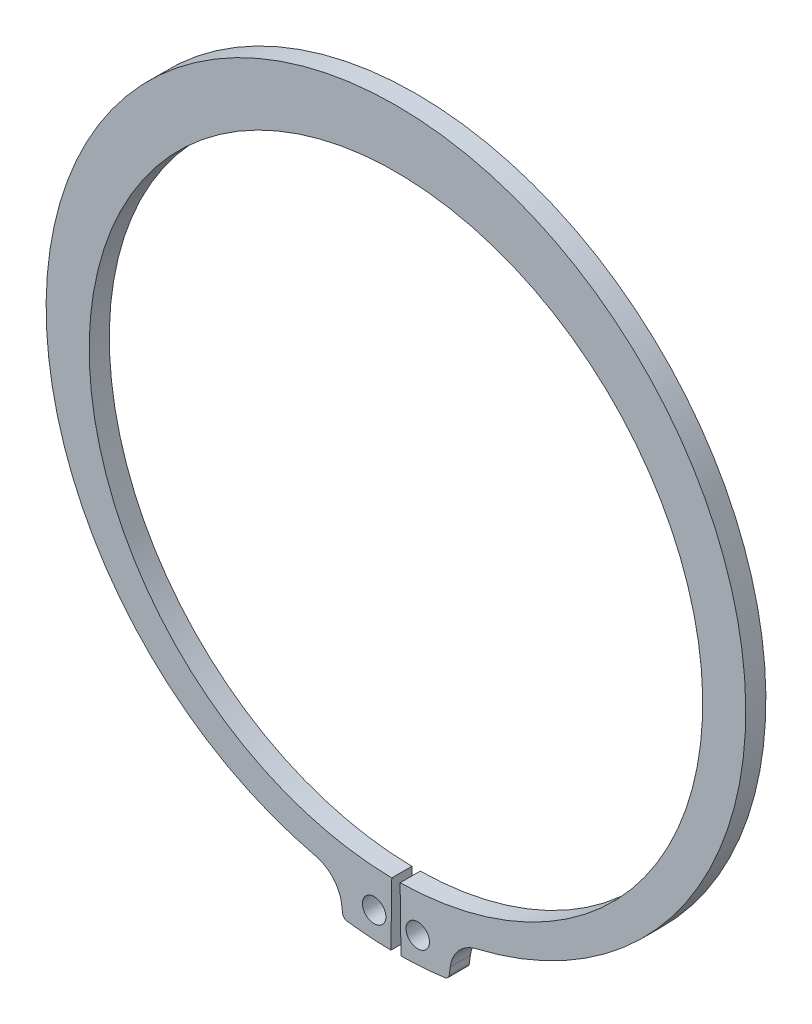
ISO-10303-21;
HEADER;
FILE_DESCRIPTION(('STEP AP214'),'2;1');
FILE_NAME('part.step','',(''),(''),'','','');
FILE_SCHEMA(('AUTOMOTIVE_DESIGN { 1 0 10303 214 1 1 1 1 }'));
ENDSEC;
DATA;
#1=APPLICATION_CONTEXT('core data for automotive mechanical design processes');
#2=APPLICATION_PROTOCOL_DEFINITION('international standard','automotive_design',2000,#1);
#3=PRODUCT_CONTEXT('',#1,'mechanical');
#4=PRODUCT('Part','Part','',(#3));
#5=PRODUCT_RELATED_PRODUCT_CATEGORY('part','',(#4));
#6=PRODUCT_DEFINITION_FORMATION('','',#4);
#7=PRODUCT_DEFINITION_CONTEXT('part definition',#1,'design');
#8=PRODUCT_DEFINITION('design','',#6,#7);
#9=PRODUCT_DEFINITION_SHAPE('','',#8);
#10=(LENGTH_UNIT() NAMED_UNIT(*) SI_UNIT(.MILLI.,.METRE.));
#11=(NAMED_UNIT(*) PLANE_ANGLE_UNIT() SI_UNIT($,.RADIAN.));
#12=(NAMED_UNIT(*) SI_UNIT($,.STERADIAN.) SOLID_ANGLE_UNIT());
#13=UNCERTAINTY_MEASURE_WITH_UNIT(LENGTH_MEASURE(1.E-05),#10,'distance_accuracy_value','');
#14=(GEOMETRIC_REPRESENTATION_CONTEXT(3) GLOBAL_UNCERTAINTY_ASSIGNED_CONTEXT((#13)) GLOBAL_UNIT_ASSIGNED_CONTEXT((#10,
#11,#12)) REPRESENTATION_CONTEXT('',''));
#15=CARTESIAN_POINT('',(0.,0.,0.));
#16=DIRECTION('',(0.,0.,1.));
#17=DIRECTION('',(1.,0.,0.));
#18=AXIS2_PLACEMENT_3D('',#15,#16,#17);
#19=CARTESIAN_POINT('',(0.,0.,-3.));
#20=DIRECTION('',(0.,0.,1.));
#21=DIRECTION('',(1.,0.,0.));
#22=AXIS2_PLACEMENT_3D('',#19,#20,#21);
#23=CYLINDRICAL_SURFACE('',#22,45.75);
#24=CARTESIAN_POINT('',(0.,0.,0.));
#25=DIRECTION('',(0.,0.,-1.));
#26=DIRECTION('',(1.,0.,0.));
#27=AXIS2_PLACEMENT_3D('',#24,#25,#26);
#28=CIRCLE('',#27,45.75);
#29=CARTESIAN_POINT('',(-0.622166817769719,-45.7457692956504,0.));
#30=VERTEX_POINT('',#29);
#31=CARTESIAN_POINT('',(0.622166817769719,-45.7457692956504,0.));
#32=VERTEX_POINT('',#31);
#33=EDGE_CURVE('E154',#30,#32,#28,.T.);
#34=ORIENTED_EDGE('',*,*,#33,.F.);
#35=DIRECTION('',(0.,0.,1.));
#36=VECTOR('',#35,1.);
#37=CARTESIAN_POINT('',(-0.622166817769719,-45.7457692956504,-3.));
#38=LINE('',#37,#36);
#39=CARTESIAN_POINT('',(-0.622166817769719,-45.7457692956504,-3.));
#40=VERTEX_POINT('',#39);
#41=EDGE_CURVE('E11',#40,#30,#38,.T.);
#42=ORIENTED_EDGE('',*,*,#41,.F.);
#43=CARTESIAN_POINT('',(0.,0.,-3.));
#44=DIRECTION('',(0.,0.,-1.));
#45=DIRECTION('',(1.,0.,0.));
#46=AXIS2_PLACEMENT_3D('',#43,#44,#45);
#47=CIRCLE('',#46,45.75);
#48=CARTESIAN_POINT('',(0.622166817769719,-45.7457692956504,-3.));
#49=VERTEX_POINT('',#48);
#50=EDGE_CURVE('E187',#40,#49,#47,.T.);
#51=ORIENTED_EDGE('',*,*,#50,.T.);
#52=DIRECTION('',(0.,0.,1.));
#53=VECTOR('',#52,1.);
#54=CARTESIAN_POINT('',(0.622166817769719,-45.7457692956504,-3.));
#55=LINE('',#54,#53);
#56=EDGE_CURVE('E36',#49,#32,#55,.T.);
#57=ORIENTED_EDGE('',*,*,#56,.T.);
#58=EDGE_LOOP('',(#34,#42,#51,#57));
#59=FACE_BOUND('',#58,.T.);
#60=ADVANCED_FACE('F33',(#59),#23,.F.);
#61=CARTESIAN_POINT('',(-0.622166817769719,-45.7457692956504,-3.));
#62=DIRECTION('',(0.999907525587986,-0.0135992747053491,0.));
#63=DIRECTION('',(0.0135992747053491,0.999907525587986,0.));
#64=AXIS2_PLACEMENT_3D('',#61,#62,#63);
#65=PLANE('',#64);
#66=DIRECTION('',(0.0135992747053491,0.999907525587986,0.));
#67=VECTOR('',#66,1.);
#68=CARTESIAN_POINT('',(-0.622166817769719,-45.7457692956504,0.));
#69=LINE('',#68,#67);
#70=CARTESIAN_POINT('',(-0.75,-55.1449000361774,0.));
#71=VERTEX_POINT('',#70);
#72=EDGE_CURVE('E185',#71,#30,#69,.T.);
#73=ORIENTED_EDGE('',*,*,#72,.F.);
#74=DIRECTION('',(0.,0.,1.));
#75=VECTOR('',#74,1.);
#76=CARTESIAN_POINT('',(-0.75,-55.1449000361774,-3.));
#77=LINE('',#76,#75);
#78=CARTESIAN_POINT('',(-0.75,-55.1449000361774,-3.));
#79=VERTEX_POINT('',#78);
#80=EDGE_CURVE('E42',#79,#71,#77,.T.);
#81=ORIENTED_EDGE('',*,*,#80,.F.);
#82=DIRECTION('',(0.0135992747053491,0.999907525587986,0.));
#83=VECTOR('',#82,1.);
#84=CARTESIAN_POINT('',(-0.622166817769719,-45.7457692956504,-3.));
#85=LINE('',#84,#83);
#86=EDGE_CURVE('E144',#79,#40,#85,.T.);
#87=ORIENTED_EDGE('',*,*,#86,.T.);
#88=ORIENTED_EDGE('',*,*,#41,.T.);
#89=EDGE_LOOP('',(#73,#81,#87,#88));
#90=FACE_BOUND('',#89,.T.);
#91=ADVANCED_FACE('F207',(#90),#65,.T.);
#92=CARTESIAN_POINT('',(0.,0.,-3.));
#93=DIRECTION('',(0.,0.,1.));
#94=DIRECTION('',(1.,0.,0.));
#95=AXIS2_PLACEMENT_3D('',#92,#93,#94);
#96=CYLINDRICAL_SURFACE('',#95,55.15);
#97=CARTESIAN_POINT('',(0.,0.,0.));
#98=DIRECTION('',(0.,0.,1.));
#99=DIRECTION('',(1.,0.,0.));
#100=AXIS2_PLACEMENT_3D('',#97,#98,#99);
#101=CIRCLE('',#100,55.15);
#102=CARTESIAN_POINT('',(-7.3051029380383,-54.6640464205191,0.));
#103=VERTEX_POINT('',#102);
#104=EDGE_CURVE('E131',#103,#71,#101,.T.);
#105=ORIENTED_EDGE('',*,*,#104,.F.);
#106=DIRECTION('',(0.,0.,1.));
#107=VECTOR('',#106,1.);
#108=CARTESIAN_POINT('',(-7.3051029380383,-54.6640464205191,-3.));
#109=LINE('',#108,#107);
#110=CARTESIAN_POINT('',(-7.3051029380383,-54.6640464205191,-3.));
#111=VERTEX_POINT('',#110);
#112=EDGE_CURVE('E126',#111,#103,#109,.T.);
#113=ORIENTED_EDGE('',*,*,#112,.F.);
#114=CARTESIAN_POINT('',(0.,0.,-3.));
#115=DIRECTION('',(0.,0.,1.));
#116=DIRECTION('',(1.,0.,0.));
#117=AXIS2_PLACEMENT_3D('',#114,#115,#116);
#118=CIRCLE('',#117,55.15);
#119=EDGE_CURVE('E129',#111,#79,#118,.T.);
#120=ORIENTED_EDGE('',*,*,#119,.T.);
#121=ORIENTED_EDGE('',*,*,#80,.T.);
#122=EDGE_LOOP('',(#105,#113,#120,#121));
#123=FACE_BOUND('',#122,.T.);
#124=ADVANCED_FACE('F128',(#123),#96,.T.);
#125=CARTESIAN_POINT('',(-7.20575883643307,-53.9206550367405,-3.));
#126=DIRECTION('',(0.,0.,1.));
#127=DIRECTION('',(1.,0.,0.));
#128=AXIS2_PLACEMENT_3D('',#125,#126,#127);
#129=CYLINDRICAL_SURFACE('',#128,0.749999999999999);
#130=CARTESIAN_POINT('',(-7.20575883643307,-53.9206550367405,0.));
#131=DIRECTION('',(0.,0.,1.));
#132=DIRECTION('',(1.,0.,0.));
#133=AXIS2_PLACEMENT_3D('',#130,#131,#132);
#134=CIRCLE('',#133,0.749999999999999);
#135=CARTESIAN_POINT('',(-7.94934248246343,-54.0185496809055,0.));
#136=VERTEX_POINT('',#135);
#137=EDGE_CURVE('E182',#136,#103,#134,.T.);
#138=ORIENTED_EDGE('',*,*,#137,.F.);
#139=DIRECTION('',(0.,0.,1.));
#140=VECTOR('',#139,1.);
#141=CARTESIAN_POINT('',(-7.94934248246343,-54.0185496809055,-3.));
#142=LINE('',#141,#140);
#143=CARTESIAN_POINT('',(-7.94934248246343,-54.0185496809055,-3.));
#144=VERTEX_POINT('',#143);
#145=EDGE_CURVE('E136',#144,#136,#142,.T.);
#146=ORIENTED_EDGE('',*,*,#145,.F.);
#147=CARTESIAN_POINT('',(-7.20575883643307,-53.9206550367405,-3.));
#148=DIRECTION('',(0.,0.,1.));
#149=DIRECTION('',(1.,0.,0.));
#150=AXIS2_PLACEMENT_3D('',#147,#148,#149);
#151=CIRCLE('',#150,0.749999999999999);
#152=EDGE_CURVE('E142',#144,#111,#151,.T.);
#153=ORIENTED_EDGE('',*,*,#152,.T.);
#154=ORIENTED_EDGE('',*,*,#112,.T.);
#155=EDGE_LOOP('',(#138,#146,#153,#154));
#156=FACE_BOUND('',#155,.T.);
#157=ADVANCED_FACE('F146',(#156),#129,.T.);
#158=CARTESIAN_POINT('',(-8.09755659471687,-52.8927517281926,-3.));
#159=DIRECTION('',(-0.99144486137381,-0.130526192220051,0.));
#160=DIRECTION('',(0.130526192220051,-0.991444861373811,0.));
#161=AXIS2_PLACEMENT_3D('',#158,#159,#160);
#162=PLANE('',#161);
#163=DIRECTION('',(0.130526192220051,-0.991444861373811,0.));
#164=VECTOR('',#163,1.);
#165=CARTESIAN_POINT('',(-8.09755659471687,-52.8927517281926,0.));
#166=LINE('',#165,#164);
#167=CARTESIAN_POINT('',(-8.09755659471687,-52.8927517281926,0.));
#168=VERTEX_POINT('',#167);
#169=EDGE_CURVE('E179',#168,#136,#166,.T.);
#170=ORIENTED_EDGE('',*,*,#169,.F.);
#171=DIRECTION('',(0.,0.,1.));
#172=VECTOR('',#171,1.);
#173=CARTESIAN_POINT('',(-8.09755659471687,-52.8927517281926,-3.));
#174=LINE('',#173,#172);
#175=CARTESIAN_POINT('',(-8.09755659471687,-52.8927517281926,-3.));
#176=VERTEX_POINT('',#175);
#177=EDGE_CURVE('E191',#176,#168,#174,.T.);
#178=ORIENTED_EDGE('',*,*,#177,.F.);
#179=DIRECTION('',(0.130526192220051,-0.991444861373811,0.));
#180=VECTOR('',#179,1.);
#181=CARTESIAN_POINT('',(-8.09755659471687,-52.8927517281926,-3.));
#182=LINE('',#181,#180);
#183=EDGE_CURVE('E147',#176,#144,#182,.T.);
#184=ORIENTED_EDGE('',*,*,#183,.T.);
#185=ORIENTED_EDGE('',*,*,#145,.T.);
#186=EDGE_LOOP('',(#170,#178,#184,#185));
#187=FACE_BOUND('',#186,.T.);
#188=ADVANCED_FACE('F220',(#187),#162,.T.);
#189=CARTESIAN_POINT('',(-13.1536965868575,-53.5584051863094,-3.));
#190=DIRECTION('',(0.,0.,1.));
#191=DIRECTION('',(1.,0.,0.));
#192=AXIS2_PLACEMENT_3D('',#189,#190,#191);
#193=CYLINDRICAL_SURFACE('',#192,5.09976922482053);
#194=CARTESIAN_POINT('',(-13.1536965868575,-53.5584051863094,0.));
#195=DIRECTION('',(0.,0.,-1.));
#196=DIRECTION('',(1.,0.,0.));
#197=AXIS2_PLACEMENT_3D('',#194,#195,#196);
#198=CIRCLE('',#197,5.09976922482053);
#199=CARTESIAN_POINT('',(-11.9823803882366,-48.594972451873,0.));
#200=VERTEX_POINT('',#199);
#201=EDGE_CURVE('E176',#200,#168,#198,.T.);
#202=ORIENTED_EDGE('',*,*,#201,.F.);
#203=DIRECTION('',(0.,0.,1.));
#204=VECTOR('',#203,1.);
#205=CARTESIAN_POINT('',(-11.9823803882366,-48.594972451873,-3.));
#206=LINE('',#205,#204);
#207=CARTESIAN_POINT('',(-11.9823803882366,-48.594972451873,-3.));
#208=VERTEX_POINT('',#207);
#209=EDGE_CURVE('E193',#208,#200,#206,.T.);
#210=ORIENTED_EDGE('',*,*,#209,.F.);
#211=CARTESIAN_POINT('',(-13.1536965868575,-53.5584051863094,-3.));
#212=DIRECTION('',(0.,0.,-1.));
#213=DIRECTION('',(1.,0.,0.));
#214=AXIS2_PLACEMENT_3D('',#211,#212,#213);
#215=CIRCLE('',#214,5.09976922482053);
#216=EDGE_CURVE('E149',#208,#176,#215,.T.);
#217=ORIENTED_EDGE('',*,*,#216,.T.);
#218=ORIENTED_EDGE('',*,*,#177,.T.);
#219=EDGE_LOOP('',(#202,#210,#217,#218));
#220=FACE_BOUND('',#219,.T.);
#221=ADVANCED_FACE('F223',(#220),#193,.F.);
#222=CARTESIAN_POINT('',(0.,2.18016335301443,-3.));
#223=DIRECTION('',(0.,0.,1.));
#224=DIRECTION('',(1.,0.,0.));
#225=AXIS2_PLACEMENT_3D('',#222,#223,#224);
#226=CYLINDRICAL_SURFACE('',#225,52.1698366469856);
#227=CARTESIAN_POINT('',(0.,2.18016335301443,0.));
#228=DIRECTION('',(0.,0.,1.));
#229=DIRECTION('',(1.,0.,0.));
#230=AXIS2_PLACEMENT_3D('',#227,#228,#229);
#231=CIRCLE('',#230,52.1698366469856);
#232=CARTESIAN_POINT('',(11.9823803882365,-48.594972451873,0.));
#233=VERTEX_POINT('',#232);
#234=EDGE_CURVE('E173',#233,#200,#231,.T.);
#235=ORIENTED_EDGE('',*,*,#234,.F.);
#236=DIRECTION('',(0.,0.,1.));
#237=VECTOR('',#236,1.);
#238=CARTESIAN_POINT('',(11.9823803882365,-48.594972451873,-3.));
#239=LINE('',#238,#237);
#240=CARTESIAN_POINT('',(11.9823803882365,-48.594972451873,-3.));
#241=VERTEX_POINT('',#240);
#242=EDGE_CURVE('E195',#241,#233,#239,.T.);
#243=ORIENTED_EDGE('',*,*,#242,.F.);
#244=CARTESIAN_POINT('',(0.,2.18016335301443,-3.));
#245=DIRECTION('',(0.,0.,1.));
#246=DIRECTION('',(1.,0.,0.));
#247=AXIS2_PLACEMENT_3D('',#244,#245,#246);
#248=CIRCLE('',#247,52.1698366469856);
#249=EDGE_CURVE('E297',#241,#208,#248,.T.);
#250=ORIENTED_EDGE('',*,*,#249,.T.);
#251=ORIENTED_EDGE('',*,*,#209,.T.);
#252=EDGE_LOOP('',(#235,#243,#250,#251));
#253=FACE_BOUND('',#252,.T.);
#254=ADVANCED_FACE('F227',(#253),#226,.T.);
#255=CARTESIAN_POINT('',(13.1536965868575,-53.5584051863094,-3.));
#256=DIRECTION('',(0.,0.,1.));
#257=DIRECTION('',(1.,0.,0.));
#258=AXIS2_PLACEMENT_3D('',#255,#256,#257);
#259=CYLINDRICAL_SURFACE('',#258,5.09976922482053);
#260=CARTESIAN_POINT('',(13.1536965868575,-53.5584051863094,0.));
#261=DIRECTION('',(0.,0.,-1.));
#262=DIRECTION('',(1.,0.,0.));
#263=AXIS2_PLACEMENT_3D('',#260,#261,#262);
#264=CIRCLE('',#263,5.09976922482053);
#265=CARTESIAN_POINT('',(8.09755659471687,-52.8927517281926,0.));
#266=VERTEX_POINT('',#265);
#267=EDGE_CURVE('E170',#266,#233,#264,.T.);
#268=ORIENTED_EDGE('',*,*,#267,.F.);
#269=DIRECTION('',(0.,0.,1.));
#270=VECTOR('',#269,1.);
#271=CARTESIAN_POINT('',(8.09755659471687,-52.8927517281926,-3.));
#272=LINE('',#271,#270);
#273=CARTESIAN_POINT('',(8.09755659471687,-52.8927517281926,-3.));
#274=VERTEX_POINT('',#273);
#275=EDGE_CURVE('E197',#274,#266,#272,.T.);
#276=ORIENTED_EDGE('',*,*,#275,.F.);
#277=CARTESIAN_POINT('',(13.1536965868575,-53.5584051863094,-3.));
#278=DIRECTION('',(0.,0.,-1.));
#279=DIRECTION('',(1.,0.,0.));
#280=AXIS2_PLACEMENT_3D('',#277,#278,#279);
#281=CIRCLE('',#280,5.09976922482053);
#282=EDGE_CURVE('E294',#274,#241,#281,.T.);
#283=ORIENTED_EDGE('',*,*,#282,.T.);
#284=ORIENTED_EDGE('',*,*,#242,.T.);
#285=EDGE_LOOP('',(#268,#276,#283,#284));
#286=FACE_BOUND('',#285,.T.);
#287=ADVANCED_FACE('F231',(#286),#259,.F.);
#288=CARTESIAN_POINT('',(8.09755659471687,-52.8927517281926,-3.));
#289=DIRECTION('',(0.99144486137381,-0.130526192220051,0.));
#290=DIRECTION('',(0.130526192220051,0.991444861373811,0.));
#291=AXIS2_PLACEMENT_3D('',#288,#289,#290);
#292=PLANE('',#291);
#293=DIRECTION('',(0.130526192220051,0.991444861373811,0.));
#294=VECTOR('',#293,1.);
#295=CARTESIAN_POINT('',(8.09755659471687,-52.8927517281926,0.));
#296=LINE('',#295,#294);
#297=CARTESIAN_POINT('',(7.94934248246343,-54.0185496809055,0.));
#298=VERTEX_POINT('',#297);
#299=EDGE_CURVE('E167',#298,#266,#296,.T.);
#300=ORIENTED_EDGE('',*,*,#299,.F.);
#301=DIRECTION('',(0.,0.,1.));
#302=VECTOR('',#301,1.);
#303=CARTESIAN_POINT('',(7.94934248246343,-54.0185496809055,-3.));
#304=LINE('',#303,#302);
#305=CARTESIAN_POINT('',(7.94934248246343,-54.0185496809055,-3.));
#306=VERTEX_POINT('',#305);
#307=EDGE_CURVE('E199',#306,#298,#304,.T.);
#308=ORIENTED_EDGE('',*,*,#307,.F.);
#309=DIRECTION('',(0.130526192220051,0.991444861373811,0.));
#310=VECTOR('',#309,1.);
#311=CARTESIAN_POINT('',(8.09755659471687,-52.8927517281926,-3.));
#312=LINE('',#311,#310);
#313=EDGE_CURVE('E291',#306,#274,#312,.T.);
#314=ORIENTED_EDGE('',*,*,#313,.T.);
#315=ORIENTED_EDGE('',*,*,#275,.T.);
#316=EDGE_LOOP('',(#300,#308,#314,#315));
#317=FACE_BOUND('',#316,.T.);
#318=ADVANCED_FACE('F235',(#317),#292,.T.);
#319=CARTESIAN_POINT('',(7.20575883643307,-53.9206550367405,-3.));
#320=DIRECTION('',(0.,0.,1.));
#321=DIRECTION('',(1.,0.,0.));
#322=AXIS2_PLACEMENT_3D('',#319,#320,#321);
#323=CYLINDRICAL_SURFACE('',#322,0.749999999999999);
#324=CARTESIAN_POINT('',(7.20575883643307,-53.9206550367405,0.));
#325=DIRECTION('',(0.,0.,1.));
#326=DIRECTION('',(-1.,0.,0.));
#327=AXIS2_PLACEMENT_3D('',#324,#325,#326);
#328=CIRCLE('',#327,0.749999999999999);
#329=CARTESIAN_POINT('',(7.30510293803831,-54.6640464205191,0.));
#330=VERTEX_POINT('',#329);
#331=EDGE_CURVE('E164',#330,#298,#328,.T.);
#332=ORIENTED_EDGE('',*,*,#331,.F.);
#333=DIRECTION('',(0.,0.,1.));
#334=VECTOR('',#333,1.);
#335=CARTESIAN_POINT('',(7.30510293803831,-54.6640464205191,-3.));
#336=LINE('',#335,#334);
#337=CARTESIAN_POINT('',(7.30510293803831,-54.6640464205191,-3.));
#338=VERTEX_POINT('',#337);
#339=EDGE_CURVE('E201',#338,#330,#336,.T.);
#340=ORIENTED_EDGE('',*,*,#339,.F.);
#341=CARTESIAN_POINT('',(7.20575883643307,-53.9206550367405,-3.));
#342=DIRECTION('',(0.,0.,1.));
#343=DIRECTION('',(-1.,0.,0.));
#344=AXIS2_PLACEMENT_3D('',#341,#342,#343);
#345=CIRCLE('',#344,0.749999999999999);
#346=EDGE_CURVE('E288',#338,#306,#345,.T.);
#347=ORIENTED_EDGE('',*,*,#346,.T.);
#348=ORIENTED_EDGE('',*,*,#307,.T.);
#349=EDGE_LOOP('',(#332,#340,#347,#348));
#350=FACE_BOUND('',#349,.T.);
#351=ADVANCED_FACE('F239',(#350),#323,.T.);
#352=CARTESIAN_POINT('',(0.,0.,-3.));
#353=DIRECTION('',(0.,0.,1.));
#354=DIRECTION('',(1.,0.,0.));
#355=AXIS2_PLACEMENT_3D('',#352,#353,#354);
#356=CYLINDRICAL_SURFACE('',#355,55.15);
#357=CARTESIAN_POINT('',(0.,0.,0.));
#358=DIRECTION('',(0.,0.,1.));
#359=DIRECTION('',(1.,0.,0.));
#360=AXIS2_PLACEMENT_3D('',#357,#358,#359);
#361=CIRCLE('',#360,55.15);
#362=CARTESIAN_POINT('',(0.749999999999962,-55.1449000361774,0.));
#363=VERTEX_POINT('',#362);
#364=EDGE_CURVE('E161',#363,#330,#361,.T.);
#365=ORIENTED_EDGE('',*,*,#364,.F.);
#366=DIRECTION('',(0.,0.,1.));
#367=VECTOR('',#366,1.);
#368=CARTESIAN_POINT('',(0.749999999999962,-55.1449000361774,-3.));
#369=LINE('',#368,#367);
#370=CARTESIAN_POINT('',(0.749999999999962,-55.1449000361774,-3.));
#371=VERTEX_POINT('',#370);
#372=EDGE_CURVE('E202',#371,#363,#369,.T.);
#373=ORIENTED_EDGE('',*,*,#372,.F.);
#374=CARTESIAN_POINT('',(0.,0.,-3.));
#375=DIRECTION('',(0.,0.,1.));
#376=DIRECTION('',(1.,0.,0.));
#377=AXIS2_PLACEMENT_3D('',#374,#375,#376);
#378=CIRCLE('',#377,55.15);
#379=EDGE_CURVE('E285',#371,#338,#378,.T.);
#380=ORIENTED_EDGE('',*,*,#379,.T.);
#381=ORIENTED_EDGE('',*,*,#339,.T.);
#382=EDGE_LOOP('',(#365,#373,#380,#381));
#383=FACE_BOUND('',#382,.T.);
#384=ADVANCED_FACE('F243',(#383),#356,.T.);
#385=CARTESIAN_POINT('',(0.622166817769719,-45.7457692956504,-3.));
#386=DIRECTION('',(-0.999907525587986,-0.0135992747053491,0.));
#387=DIRECTION('',(0.0135992747053491,-0.999907525587986,0.));
#388=AXIS2_PLACEMENT_3D('',#385,#386,#387);
#389=PLANE('',#388);
#390=DIRECTION('',(0.0135992747053491,-0.999907525587986,0.));
#391=VECTOR('',#390,1.);
#392=CARTESIAN_POINT('',(0.622166817769719,-45.7457692956504,0.));
#393=LINE('',#392,#391);
#394=EDGE_CURVE('E157',#32,#363,#393,.T.);
#395=ORIENTED_EDGE('',*,*,#394,.F.);
#396=ORIENTED_EDGE('',*,*,#56,.F.);
#397=DIRECTION('',(0.0135992747053491,-0.999907525587986,0.));
#398=VECTOR('',#397,1.);
#399=CARTESIAN_POINT('',(0.622166817769719,-45.7457692956504,-3.));
#400=LINE('',#399,#398);
#401=EDGE_CURVE('E283',#49,#371,#400,.T.);
#402=ORIENTED_EDGE('',*,*,#401,.T.);
#403=ORIENTED_EDGE('',*,*,#372,.T.);
#404=EDGE_LOOP('',(#395,#396,#402,#403));
#405=FACE_BOUND('',#404,.T.);
#406=ADVANCED_FACE('F204',(#405),#389,.T.);
#407=CARTESIAN_POINT('',(0.,0.,-3.));
#408=DIRECTION('',(0.,0.,1.));
#409=DIRECTION('',(1.,0.,0.));
#410=AXIS2_PLACEMENT_3D('',#407,#408,#409);
#411=PLANE('',#410);
#412=CARTESIAN_POINT('',(-3.25,-51.2219984479325,-3.));
#413=DIRECTION('',(0.,0.,1.));
#414=DIRECTION('',(1.,0.,0.));
#415=AXIS2_PLACEMENT_3D('',#412,#413,#414);
#416=CIRCLE('',#415,1.75);
#417=CARTESIAN_POINT('',(-1.5,-51.2219984479325,-3.));
#418=VERTEX_POINT('',#417);
#419=EDGE_CURVE('E270',#418,#418,#416,.T.);
#420=ORIENTED_EDGE('',*,*,#419,.T.);
#421=EDGE_LOOP('',(#420));
#422=FACE_BOUND('',#421,.T.);
#423=CARTESIAN_POINT('',(3.25,-51.2219984479325,-3.));
#424=DIRECTION('',(0.,0.,1.));
#425=DIRECTION('',(1.,0.,0.));
#426=AXIS2_PLACEMENT_3D('',#423,#424,#425);
#427=CIRCLE('',#426,1.75);
#428=CARTESIAN_POINT('',(5.,-51.2219984479325,-3.));
#429=VERTEX_POINT('',#428);
#430=EDGE_CURVE('E158',#429,#429,#427,.T.);
#431=ORIENTED_EDGE('',*,*,#430,.T.);
#432=EDGE_LOOP('',(#431));
#433=FACE_BOUND('',#432,.T.);
#434=ORIENTED_EDGE('',*,*,#50,.F.);
#435=ORIENTED_EDGE('',*,*,#86,.F.);
#436=ORIENTED_EDGE('',*,*,#119,.F.);
#437=ORIENTED_EDGE('',*,*,#152,.F.);
#438=ORIENTED_EDGE('',*,*,#183,.F.);
#439=ORIENTED_EDGE('',*,*,#216,.F.);
#440=ORIENTED_EDGE('',*,*,#249,.F.);
#441=ORIENTED_EDGE('',*,*,#282,.F.);
#442=ORIENTED_EDGE('',*,*,#313,.F.);
#443=ORIENTED_EDGE('',*,*,#346,.F.);
#444=ORIENTED_EDGE('',*,*,#379,.F.);
#445=ORIENTED_EDGE('',*,*,#401,.F.);
#446=EDGE_LOOP('',(#434,#435,#436,#437,#438,#439,#440,#441,#442,#443,#444,#445));
#447=FACE_BOUND('',#446,.T.);
#448=ADVANCED_FACE('F140',(#422,#433,#447),#411,.F.);
#449=CARTESIAN_POINT('',(0.,0.,0.));
#450=DIRECTION('',(0.,0.,1.));
#451=DIRECTION('',(1.,0.,0.));
#452=AXIS2_PLACEMENT_3D('',#449,#450,#451);
#453=PLANE('',#452);
#454=CARTESIAN_POINT('',(-3.25,-51.2219984479325,0.));
#455=DIRECTION('',(0.,0.,1.));
#456=DIRECTION('',(1.,0.,0.));
#457=AXIS2_PLACEMENT_3D('',#454,#455,#456);
#458=CIRCLE('',#457,1.75);
#459=CARTESIAN_POINT('',(-1.5,-51.2219984479325,0.));
#460=VERTEX_POINT('',#459);
#461=EDGE_CURVE('E273',#460,#460,#458,.T.);
#462=ORIENTED_EDGE('',*,*,#461,.F.);
#463=EDGE_LOOP('',(#462));
#464=FACE_BOUND('',#463,.T.);
#465=CARTESIAN_POINT('',(3.25,-51.2219984479325,0.));
#466=DIRECTION('',(0.,0.,1.));
#467=DIRECTION('',(1.,0.,0.));
#468=AXIS2_PLACEMENT_3D('',#465,#466,#467);
#469=CIRCLE('',#468,1.75);
#470=CARTESIAN_POINT('',(5.,-51.2219984479325,0.));
#471=VERTEX_POINT('',#470);
#472=EDGE_CURVE('E275',#471,#471,#469,.T.);
#473=ORIENTED_EDGE('',*,*,#472,.F.);
#474=EDGE_LOOP('',(#473));
#475=FACE_BOUND('',#474,.T.);
#476=ORIENTED_EDGE('',*,*,#33,.T.);
#477=ORIENTED_EDGE('',*,*,#394,.T.);
#478=ORIENTED_EDGE('',*,*,#364,.T.);
#479=ORIENTED_EDGE('',*,*,#331,.T.);
#480=ORIENTED_EDGE('',*,*,#299,.T.);
#481=ORIENTED_EDGE('',*,*,#267,.T.);
#482=ORIENTED_EDGE('',*,*,#234,.T.);
#483=ORIENTED_EDGE('',*,*,#201,.T.);
#484=ORIENTED_EDGE('',*,*,#169,.T.);
#485=ORIENTED_EDGE('',*,*,#137,.T.);
#486=ORIENTED_EDGE('',*,*,#104,.T.);
#487=ORIENTED_EDGE('',*,*,#72,.T.);
#488=EDGE_LOOP('',(#476,#477,#478,#479,#480,#481,#482,#483,#484,#485,#486,#487));
#489=FACE_BOUND('',#488,.T.);
#490=ADVANCED_FACE('F206',(#464,#475,#489),#453,.T.);
#491=CARTESIAN_POINT('',(3.25,-51.2219984479325,-3.));
#492=DIRECTION('',(0.,0.,1.));
#493=DIRECTION('',(1.,0.,0.));
#494=AXIS2_PLACEMENT_3D('',#491,#492,#493);
#495=CYLINDRICAL_SURFACE('',#494,1.75);
#496=ORIENTED_EDGE('',*,*,#430,.F.);
#497=EDGE_LOOP('',(#496));
#498=FACE_BOUND('',#497,.T.);
#499=ORIENTED_EDGE('',*,*,#472,.T.);
#500=EDGE_LOOP('',(#499));
#501=FACE_BOUND('',#500,.T.);
#502=ADVANCED_FACE('F255',(#498,#501),#495,.F.);
#503=CARTESIAN_POINT('',(-3.25,-51.2219984479325,-3.));
#504=DIRECTION('',(0.,0.,1.));
#505=DIRECTION('',(1.,0.,0.));
#506=AXIS2_PLACEMENT_3D('',#503,#504,#505);
#507=CYLINDRICAL_SURFACE('',#506,1.75);
#508=ORIENTED_EDGE('',*,*,#419,.F.);
#509=EDGE_LOOP('',(#508));
#510=FACE_BOUND('',#509,.T.);
#511=ORIENTED_EDGE('',*,*,#461,.T.);
#512=EDGE_LOOP('',(#511));
#513=FACE_BOUND('',#512,.T.);
#514=ADVANCED_FACE('F262',(#510,#513),#507,.F.);
#515=CLOSED_SHELL('',(#60,#91,#124,#157,#188,#221,#254,#287,#318,#351,#384,#406,#448,#490,#502,#514));
#516=MANIFOLD_SOLID_BREP('B2',#515);
#517=ADVANCED_BREP_SHAPE_REPRESENTATION('',(#18,#516),#14);
#518=SHAPE_DEFINITION_REPRESENTATION(#9,#517);
ENDSEC;
END-ISO-10303-21;
